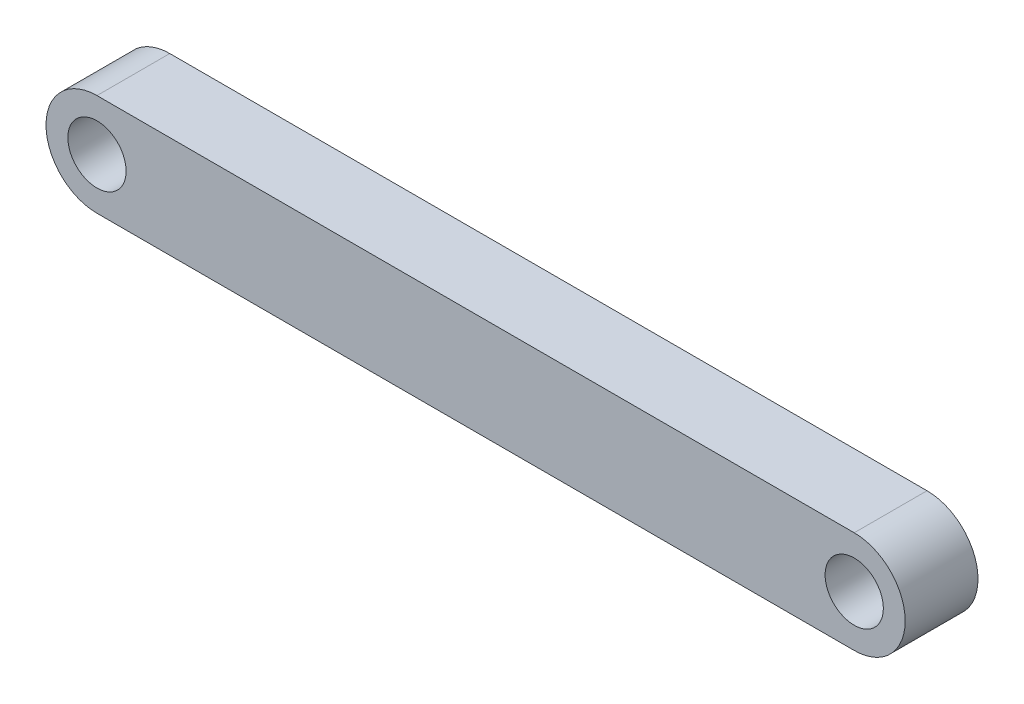
ISO-10303-21;
HEADER;
FILE_DESCRIPTION(('STEP AP214'),'2;1');
FILE_NAME('part.step','',(''),(''),'','','');
FILE_SCHEMA(('AUTOMOTIVE_DESIGN { 1 0 10303 214 1 1 1 1 }'));
ENDSEC;
DATA;
#1=APPLICATION_CONTEXT('core data for automotive mechanical design processes');
#2=APPLICATION_PROTOCOL_DEFINITION('international standard','automotive_design',2000,#1);
#3=PRODUCT_CONTEXT('',#1,'mechanical');
#4=PRODUCT('Part','Part','',(#3));
#5=PRODUCT_RELATED_PRODUCT_CATEGORY('part','',(#4));
#6=PRODUCT_DEFINITION_FORMATION('','',#4);
#7=PRODUCT_DEFINITION_CONTEXT('part definition',#1,'design');
#8=PRODUCT_DEFINITION('design','',#6,#7);
#9=PRODUCT_DEFINITION_SHAPE('','',#8);
#10=(LENGTH_UNIT() NAMED_UNIT(*) SI_UNIT(.MILLI.,.METRE.));
#11=(NAMED_UNIT(*) PLANE_ANGLE_UNIT() SI_UNIT($,.RADIAN.));
#12=(NAMED_UNIT(*) SI_UNIT($,.STERADIAN.) SOLID_ANGLE_UNIT());
#13=UNCERTAINTY_MEASURE_WITH_UNIT(LENGTH_MEASURE(1.E-05),#10,'distance_accuracy_value','');
#14=(GEOMETRIC_REPRESENTATION_CONTEXT(3) GLOBAL_UNCERTAINTY_ASSIGNED_CONTEXT((#13)) GLOBAL_UNIT_ASSIGNED_CONTEXT((#10,
#11,#12)) REPRESENTATION_CONTEXT('',''));
#15=CARTESIAN_POINT('',(0.,0.,0.));
#16=DIRECTION('',(0.,0.,1.));
#17=DIRECTION('',(1.,0.,0.));
#18=AXIS2_PLACEMENT_3D('',#15,#16,#17);
#19=CARTESIAN_POINT('',(26.,0.,5.));
#20=DIRECTION('',(0.,0.,-1.));
#21=DIRECTION('',(-1.,0.,0.));
#22=AXIS2_PLACEMENT_3D('',#19,#20,#21);
#23=CYLINDRICAL_SURFACE('',#22,2.);
#24=CARTESIAN_POINT('',(26.,0.,5.));
#25=DIRECTION('',(0.,0.,1.));
#26=DIRECTION('',(1.,0.,0.));
#27=AXIS2_PLACEMENT_3D('',#24,#25,#26);
#28=CIRCLE('',#27,2.);
#29=CARTESIAN_POINT('',(28.,0.,5.));
#30=VERTEX_POINT('',#29);
#31=EDGE_CURVE('E133',#30,#30,#28,.T.);
#32=ORIENTED_EDGE('',*,*,#31,.T.);
#33=EDGE_LOOP('',(#32));
#34=FACE_BOUND('',#33,.T.);
#35=CARTESIAN_POINT('',(26.,0.,0.));
#36=DIRECTION('',(0.,0.,1.));
#37=DIRECTION('',(1.,0.,0.));
#38=AXIS2_PLACEMENT_3D('',#35,#36,#37);
#39=CIRCLE('',#38,2.);
#40=CARTESIAN_POINT('',(28.,0.,0.));
#41=VERTEX_POINT('',#40);
#42=EDGE_CURVE('E135',#41,#41,#39,.T.);
#43=ORIENTED_EDGE('',*,*,#42,.F.);
#44=EDGE_LOOP('',(#43));
#45=FACE_BOUND('',#44,.T.);
#46=ADVANCED_FACE('F71',(#34,#45),#23,.F.);
#47=CARTESIAN_POINT('',(0.,3.5,5.));
#48=DIRECTION('',(0.,1.,0.));
#49=DIRECTION('',(-1.,0.,0.));
#50=AXIS2_PLACEMENT_3D('',#47,#48,#49);
#51=PLANE('',#50);
#52=DIRECTION('',(1.,0.,0.));
#53=VECTOR('',#52,1.);
#54=CARTESIAN_POINT('',(0.,3.5,0.));
#55=LINE('',#54,#53);
#56=CARTESIAN_POINT('',(-26.,3.5,0.));
#57=VERTEX_POINT('',#56);
#58=CARTESIAN_POINT('',(26.,3.5,0.));
#59=VERTEX_POINT('',#58);
#60=EDGE_CURVE('E124',#57,#59,#55,.T.);
#61=ORIENTED_EDGE('',*,*,#60,.F.);
#62=DIRECTION('',(0.,0.,-1.));
#63=VECTOR('',#62,1.);
#64=CARTESIAN_POINT('',(-26.,3.5,5.));
#65=LINE('',#64,#63);
#66=CARTESIAN_POINT('',(-26.,3.5,5.));
#67=VERTEX_POINT('',#66);
#68=EDGE_CURVE('E81',#67,#57,#65,.T.);
#69=ORIENTED_EDGE('',*,*,#68,.F.);
#70=DIRECTION('',(1.,0.,0.));
#71=VECTOR('',#70,1.);
#72=CARTESIAN_POINT('',(0.,3.5,5.));
#73=LINE('',#72,#71);
#74=CARTESIAN_POINT('',(26.,3.5,5.));
#75=VERTEX_POINT('',#74);
#76=EDGE_CURVE('E122',#67,#75,#73,.T.);
#77=ORIENTED_EDGE('',*,*,#76,.T.);
#78=DIRECTION('',(0.,0.,-1.));
#79=VECTOR('',#78,1.);
#80=CARTESIAN_POINT('',(26.,3.5,5.));
#81=LINE('',#80,#79);
#82=EDGE_CURVE('E12',#75,#59,#81,.T.);
#83=ORIENTED_EDGE('',*,*,#82,.T.);
#84=EDGE_LOOP('',(#61,#69,#77,#83));
#85=FACE_BOUND('',#84,.T.);
#86=ADVANCED_FACE('F121',(#85),#51,.T.);
#87=CARTESIAN_POINT('',(0.,-3.5,5.));
#88=DIRECTION('',(0.,1.,0.));
#89=DIRECTION('',(-1.,0.,0.));
#90=AXIS2_PLACEMENT_3D('',#87,#88,#89);
#91=PLANE('',#90);
#92=DIRECTION('',(1.,0.,0.));
#93=VECTOR('',#92,1.);
#94=CARTESIAN_POINT('',(0.,-3.5,0.));
#95=LINE('',#94,#93);
#96=CARTESIAN_POINT('',(-26.,-3.5,0.));
#97=VERTEX_POINT('',#96);
#98=CARTESIAN_POINT('',(26.,-3.5,0.));
#99=VERTEX_POINT('',#98);
#100=EDGE_CURVE('E109',#97,#99,#95,.T.);
#101=ORIENTED_EDGE('',*,*,#100,.T.);
#102=DIRECTION('',(0.,0.,-1.));
#103=VECTOR('',#102,1.);
#104=CARTESIAN_POINT('',(26.,-3.5,5.));
#105=LINE('',#104,#103);
#106=CARTESIAN_POINT('',(26.,-3.5,5.));
#107=VERTEX_POINT('',#106);
#108=EDGE_CURVE('E140',#107,#99,#105,.T.);
#109=ORIENTED_EDGE('',*,*,#108,.F.);
#110=DIRECTION('',(1.,0.,0.));
#111=VECTOR('',#110,1.);
#112=CARTESIAN_POINT('',(0.,-3.5,5.));
#113=LINE('',#112,#111);
#114=CARTESIAN_POINT('',(-26.,-3.5,5.));
#115=VERTEX_POINT('',#114);
#116=EDGE_CURVE('E90',#115,#107,#113,.T.);
#117=ORIENTED_EDGE('',*,*,#116,.F.);
#118=DIRECTION('',(0.,0.,-1.));
#119=VECTOR('',#118,1.);
#120=CARTESIAN_POINT('',(-26.,-3.5,5.));
#121=LINE('',#120,#119);
#122=EDGE_CURVE('E105',#115,#97,#121,.T.);
#123=ORIENTED_EDGE('',*,*,#122,.T.);
#124=EDGE_LOOP('',(#101,#109,#117,#123));
#125=FACE_BOUND('',#124,.T.);
#126=ADVANCED_FACE('F173',(#125),#91,.F.);
#127=CARTESIAN_POINT('',(26.,0.,5.));
#128=DIRECTION('',(0.,0.,-1.));
#129=DIRECTION('',(-1.,0.,0.));
#130=AXIS2_PLACEMENT_3D('',#127,#128,#129);
#131=CYLINDRICAL_SURFACE('',#130,3.5);
#132=CARTESIAN_POINT('',(26.,0.,0.));
#133=DIRECTION('',(0.,0.,1.));
#134=DIRECTION('',(1.,0.,0.));
#135=AXIS2_PLACEMENT_3D('',#132,#133,#134);
#136=CIRCLE('',#135,3.5);
#137=EDGE_CURVE('E129',#99,#59,#136,.T.);
#138=ORIENTED_EDGE('',*,*,#137,.T.);
#139=ORIENTED_EDGE('',*,*,#82,.F.);
#140=CARTESIAN_POINT('',(26.,0.,5.));
#141=DIRECTION('',(0.,0.,1.));
#142=DIRECTION('',(1.,0.,0.));
#143=AXIS2_PLACEMENT_3D('',#140,#141,#142);
#144=CIRCLE('',#143,3.5);
#145=EDGE_CURVE('E114',#107,#75,#144,.T.);
#146=ORIENTED_EDGE('',*,*,#145,.F.);
#147=ORIENTED_EDGE('',*,*,#108,.T.);
#148=EDGE_LOOP('',(#138,#139,#146,#147));
#149=FACE_BOUND('',#148,.T.);
#150=ADVANCED_FACE('F179',(#149),#131,.T.);
#151=CARTESIAN_POINT('',(0.,0.,0.));
#152=DIRECTION('',(0.,0.,1.));
#153=DIRECTION('',(1.,0.,0.));
#154=AXIS2_PLACEMENT_3D('',#151,#152,#153);
#155=PLANE('',#154);
#156=ORIENTED_EDGE('',*,*,#137,.F.);
#157=ORIENTED_EDGE('',*,*,#100,.F.);
#158=CARTESIAN_POINT('',(-26.,0.,0.));
#159=DIRECTION('',(0.,0.,1.));
#160=DIRECTION('',(1.,0.,0.));
#161=AXIS2_PLACEMENT_3D('',#158,#159,#160);
#162=CIRCLE('',#161,3.5);
#163=EDGE_CURVE('E75',#57,#97,#162,.T.);
#164=ORIENTED_EDGE('',*,*,#163,.F.);
#165=ORIENTED_EDGE('',*,*,#60,.T.);
#166=EDGE_LOOP('',(#156,#157,#164,#165));
#167=FACE_BOUND('',#166,.T.);
#168=ORIENTED_EDGE('',*,*,#42,.T.);
#169=EDGE_LOOP('',(#168));
#170=FACE_BOUND('',#169,.T.);
#171=CARTESIAN_POINT('',(-26.,0.,0.));
#172=DIRECTION('',(0.,0.,1.));
#173=DIRECTION('',(1.,0.,0.));
#174=AXIS2_PLACEMENT_3D('',#171,#172,#173);
#175=CIRCLE('',#174,2.);
#176=CARTESIAN_POINT('',(-24.,0.,0.));
#177=VERTEX_POINT('',#176);
#178=EDGE_CURVE('E152',#177,#177,#175,.T.);
#179=ORIENTED_EDGE('',*,*,#178,.T.);
#180=EDGE_LOOP('',(#179));
#181=FACE_BOUND('',#180,.T.);
#182=ADVANCED_FACE('F156',(#167,#170,#181),#155,.F.);
#183=CARTESIAN_POINT('',(0.,0.,5.));
#184=DIRECTION('',(0.,0.,1.));
#185=DIRECTION('',(1.,0.,0.));
#186=AXIS2_PLACEMENT_3D('',#183,#184,#185);
#187=PLANE('',#186);
#188=ORIENTED_EDGE('',*,*,#145,.T.);
#189=ORIENTED_EDGE('',*,*,#76,.F.);
#190=CARTESIAN_POINT('',(-26.,0.,5.));
#191=DIRECTION('',(0.,0.,1.));
#192=DIRECTION('',(1.,0.,0.));
#193=AXIS2_PLACEMENT_3D('',#190,#191,#192);
#194=CIRCLE('',#193,3.5);
#195=EDGE_CURVE('E128',#67,#115,#194,.T.);
#196=ORIENTED_EDGE('',*,*,#195,.T.);
#197=ORIENTED_EDGE('',*,*,#116,.T.);
#198=EDGE_LOOP('',(#188,#189,#196,#197));
#199=FACE_BOUND('',#198,.T.);
#200=ORIENTED_EDGE('',*,*,#31,.F.);
#201=EDGE_LOOP('',(#200));
#202=FACE_BOUND('',#201,.T.);
#203=CARTESIAN_POINT('',(-26.,0.,5.));
#204=DIRECTION('',(0.,0.,1.));
#205=DIRECTION('',(1.,0.,0.));
#206=AXIS2_PLACEMENT_3D('',#203,#204,#205);
#207=CIRCLE('',#206,2.);
#208=CARTESIAN_POINT('',(-24.,0.,5.));
#209=VERTEX_POINT('',#208);
#210=EDGE_CURVE('E149',#209,#209,#207,.T.);
#211=ORIENTED_EDGE('',*,*,#210,.F.);
#212=EDGE_LOOP('',(#211));
#213=FACE_BOUND('',#212,.T.);
#214=ADVANCED_FACE('F130',(#199,#202,#213),#187,.T.);
#215=CARTESIAN_POINT('',(-26.,0.,5.));
#216=DIRECTION('',(0.,0.,-1.));
#217=DIRECTION('',(-1.,0.,0.));
#218=AXIS2_PLACEMENT_3D('',#215,#216,#217);
#219=CYLINDRICAL_SURFACE('',#218,2.);
#220=ORIENTED_EDGE('',*,*,#210,.T.);
#221=EDGE_LOOP('',(#220));
#222=FACE_BOUND('',#221,.T.);
#223=ORIENTED_EDGE('',*,*,#178,.F.);
#224=EDGE_LOOP('',(#223));
#225=FACE_BOUND('',#224,.T.);
#226=ADVANCED_FACE('F158',(#222,#225),#219,.F.);
#227=CARTESIAN_POINT('',(-26.,0.,5.));
#228=DIRECTION('',(0.,0.,-1.));
#229=DIRECTION('',(-1.,0.,0.));
#230=AXIS2_PLACEMENT_3D('',#227,#228,#229);
#231=CYLINDRICAL_SURFACE('',#230,3.5);
#232=ORIENTED_EDGE('',*,*,#68,.T.);
#233=ORIENTED_EDGE('',*,*,#163,.T.);
#234=ORIENTED_EDGE('',*,*,#122,.F.);
#235=ORIENTED_EDGE('',*,*,#195,.F.);
#236=EDGE_LOOP('',(#232,#233,#234,#235));
#237=FACE_BOUND('',#236,.T.);
#238=ADVANCED_FACE('F73',(#237),#231,.T.);
#239=CLOSED_SHELL('',(#46,#86,#126,#150,#182,#214,#226,#238));
#240=MANIFOLD_SOLID_BREP('B2',#239);
#241=ADVANCED_BREP_SHAPE_REPRESENTATION('',(#18,#240),#14);
#242=SHAPE_DEFINITION_REPRESENTATION(#9,#241);
ENDSEC;
END-ISO-10303-21;
